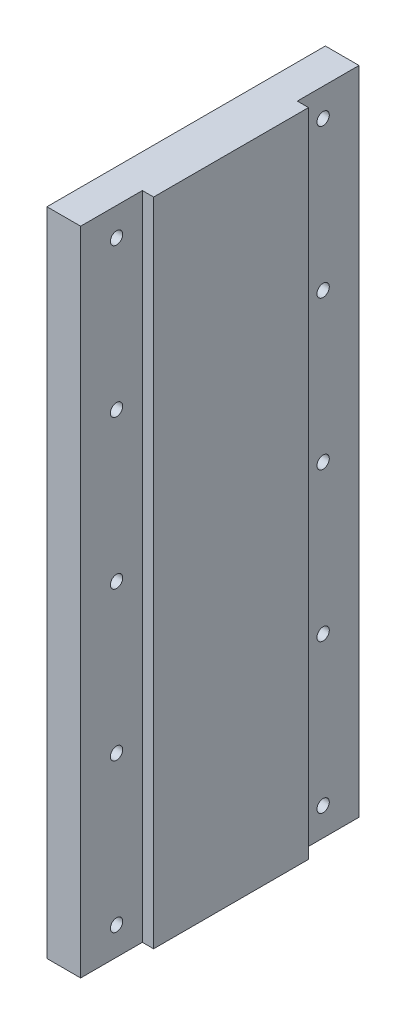
ISO-10303-21;
HEADER;
FILE_DESCRIPTION(('STEP AP214'),'2;1');
FILE_NAME('part.step','',(''),(''),'','','');
FILE_SCHEMA(('AUTOMOTIVE_DESIGN { 1 0 10303 214 1 1 1 1 }'));
ENDSEC;
DATA;
#1=APPLICATION_CONTEXT('core data for automotive mechanical design processes');
#2=APPLICATION_PROTOCOL_DEFINITION('international standard','automotive_design',2000,#1);
#3=PRODUCT_CONTEXT('',#1,'mechanical');
#4=PRODUCT('Part','Part','',(#3));
#5=PRODUCT_RELATED_PRODUCT_CATEGORY('part','',(#4));
#6=PRODUCT_DEFINITION_FORMATION('','',#4);
#7=PRODUCT_DEFINITION_CONTEXT('part definition',#1,'design');
#8=PRODUCT_DEFINITION('design','',#6,#7);
#9=PRODUCT_DEFINITION_SHAPE('','',#8);
#10=(LENGTH_UNIT() NAMED_UNIT(*) SI_UNIT(.MILLI.,.METRE.));
#11=(NAMED_UNIT(*) PLANE_ANGLE_UNIT() SI_UNIT($,.RADIAN.));
#12=(NAMED_UNIT(*) SI_UNIT($,.STERADIAN.) SOLID_ANGLE_UNIT());
#13=UNCERTAINTY_MEASURE_WITH_UNIT(LENGTH_MEASURE(1.E-05),#10,'distance_accuracy_value','');
#14=(GEOMETRIC_REPRESENTATION_CONTEXT(3) GLOBAL_UNCERTAINTY_ASSIGNED_CONTEXT((#13)) GLOBAL_UNIT_ASSIGNED_CONTEXT((#10,
#11,#12)) REPRESENTATION_CONTEXT('',''));
#15=CARTESIAN_POINT('',(0.,0.,0.));
#16=DIRECTION('',(0.,0.,1.));
#17=DIRECTION('',(1.,0.,0.));
#18=AXIS2_PLACEMENT_3D('',#15,#16,#17);
#19=CARTESIAN_POINT('',(30.,580.,0.));
#20=DIRECTION('',(0.,0.,1.));
#21=DIRECTION('',(1.,0.,0.));
#22=AXIS2_PLACEMENT_3D('',#19,#20,#21);
#23=PLANE('',#22);
#24=DIRECTION('',(-1.,0.,0.));
#25=VECTOR('',#24,1.);
#26=CARTESIAN_POINT('',(30.,0.,0.));
#27=LINE('',#26,#25);
#28=CARTESIAN_POINT('',(30.,0.,0.));
#29=VERTEX_POINT('',#28);
#30=CARTESIAN_POINT('',(0.,0.,0.));
#31=VERTEX_POINT('',#30);
#32=EDGE_CURVE('E136',#29,#31,#27,.T.);
#33=ORIENTED_EDGE('',*,*,#32,.T.);
#34=DIRECTION('',(0.,-1.,0.));
#35=VECTOR('',#34,1.);
#36=CARTESIAN_POINT('',(0.,580.,0.));
#37=LINE('',#36,#35);
#38=CARTESIAN_POINT('',(0.,580.,0.));
#39=VERTEX_POINT('',#38);
#40=EDGE_CURVE('E164',#39,#31,#37,.T.);
#41=ORIENTED_EDGE('',*,*,#40,.F.);
#42=DIRECTION('',(-1.,0.,0.));
#43=VECTOR('',#42,1.);
#44=CARTESIAN_POINT('',(30.,580.,0.));
#45=LINE('',#44,#43);
#46=CARTESIAN_POINT('',(30.,580.,0.));
#47=VERTEX_POINT('',#46);
#48=EDGE_CURVE('E151',#47,#39,#45,.T.);
#49=ORIENTED_EDGE('',*,*,#48,.F.);
#50=DIRECTION('',(0.,-1.,0.));
#51=VECTOR('',#50,1.);
#52=CARTESIAN_POINT('',(30.,580.,0.));
#53=LINE('',#52,#51);
#54=EDGE_CURVE('E132',#47,#29,#53,.T.);
#55=ORIENTED_EDGE('',*,*,#54,.T.);
#56=EDGE_LOOP('',(#33,#41,#49,#55));
#57=FACE_BOUND('',#56,.T.);
#58=ADVANCED_FACE('F37',(#57),#23,.F.);
#59=CARTESIAN_POINT('',(0.,580.,0.));
#60=DIRECTION('',(1.,0.,0.));
#61=DIRECTION('',(0.,0.,-1.));
#62=AXIS2_PLACEMENT_3D('',#59,#60,#61);
#63=PLANE('',#62);
#64=CARTESIAN_POINT('',(0.,555.,216.));
#65=DIRECTION('',(1.,0.,0.));
#66=DIRECTION('',(0.,0.,-1.));
#67=AXIS2_PLACEMENT_3D('',#64,#65,#66);
#68=CIRCLE('',#67,11.5000000000001);
#69=CARTESIAN_POINT('',(0.,555.,204.5));
#70=VERTEX_POINT('',#69);
#71=EDGE_CURVE('E11',#70,#70,#68,.T.);
#72=ORIENTED_EDGE('',*,*,#71,.T.);
#73=EDGE_LOOP('',(#72));
#74=FACE_BOUND('',#73,.T.);
#75=CARTESIAN_POINT('',(0.,555.,32.));
#76=DIRECTION('',(1.,0.,0.));
#77=DIRECTION('',(0.,0.,-1.));
#78=AXIS2_PLACEMENT_3D('',#75,#76,#77);
#79=CIRCLE('',#78,11.5000000000001);
#80=CARTESIAN_POINT('',(0.,555.,20.4999999999999));
#81=VERTEX_POINT('',#80);
#82=EDGE_CURVE('E217',#81,#81,#79,.T.);
#83=ORIENTED_EDGE('',*,*,#82,.T.);
#84=EDGE_LOOP('',(#83));
#85=FACE_BOUND('',#84,.T.);
#86=CARTESIAN_POINT('',(0.,422.5,216.));
#87=DIRECTION('',(1.,0.,0.));
#88=DIRECTION('',(0.,0.,-1.));
#89=AXIS2_PLACEMENT_3D('',#86,#87,#88);
#90=CIRCLE('',#89,11.5000000000001);
#91=CARTESIAN_POINT('',(0.,422.5,204.5));
#92=VERTEX_POINT('',#91);
#93=EDGE_CURVE('E211',#92,#92,#90,.T.);
#94=ORIENTED_EDGE('',*,*,#93,.T.);
#95=EDGE_LOOP('',(#94));
#96=FACE_BOUND('',#95,.T.);
#97=CARTESIAN_POINT('',(0.,422.5,32.));
#98=DIRECTION('',(1.,0.,0.));
#99=DIRECTION('',(0.,0.,-1.));
#100=AXIS2_PLACEMENT_3D('',#97,#98,#99);
#101=CIRCLE('',#100,11.5000000000001);
#102=CARTESIAN_POINT('',(0.,422.5,20.4999999999999));
#103=VERTEX_POINT('',#102);
#104=EDGE_CURVE('E205',#103,#103,#101,.T.);
#105=ORIENTED_EDGE('',*,*,#104,.T.);
#106=EDGE_LOOP('',(#105));
#107=FACE_BOUND('',#106,.T.);
#108=CARTESIAN_POINT('',(0.,290.,216.));
#109=DIRECTION('',(1.,0.,0.));
#110=DIRECTION('',(0.,0.,-1.));
#111=AXIS2_PLACEMENT_3D('',#108,#109,#110);
#112=CIRCLE('',#111,11.5000000000001);
#113=CARTESIAN_POINT('',(0.,290.,204.5));
#114=VERTEX_POINT('',#113);
#115=EDGE_CURVE('E199',#114,#114,#112,.T.);
#116=ORIENTED_EDGE('',*,*,#115,.T.);
#117=EDGE_LOOP('',(#116));
#118=FACE_BOUND('',#117,.T.);
#119=CARTESIAN_POINT('',(0.,290.,32.));
#120=DIRECTION('',(1.,0.,0.));
#121=DIRECTION('',(0.,0.,-1.));
#122=AXIS2_PLACEMENT_3D('',#119,#120,#121);
#123=CIRCLE('',#122,11.5000000000001);
#124=CARTESIAN_POINT('',(0.,290.,20.4999999999999));
#125=VERTEX_POINT('',#124);
#126=EDGE_CURVE('E193',#125,#125,#123,.T.);
#127=ORIENTED_EDGE('',*,*,#126,.T.);
#128=EDGE_LOOP('',(#127));
#129=FACE_BOUND('',#128,.T.);
#130=CARTESIAN_POINT('',(0.,157.5,216.));
#131=DIRECTION('',(1.,0.,0.));
#132=DIRECTION('',(0.,0.,-1.));
#133=AXIS2_PLACEMENT_3D('',#130,#131,#132);
#134=CIRCLE('',#133,11.5000000000001);
#135=CARTESIAN_POINT('',(0.,157.5,204.5));
#136=VERTEX_POINT('',#135);
#137=EDGE_CURVE('E187',#136,#136,#134,.T.);
#138=ORIENTED_EDGE('',*,*,#137,.T.);
#139=EDGE_LOOP('',(#138));
#140=FACE_BOUND('',#139,.T.);
#141=CARTESIAN_POINT('',(0.,157.5,32.));
#142=DIRECTION('',(1.,0.,0.));
#143=DIRECTION('',(0.,0.,-1.));
#144=AXIS2_PLACEMENT_3D('',#141,#142,#143);
#145=CIRCLE('',#144,11.5000000000001);
#146=CARTESIAN_POINT('',(0.,157.5,20.4999999999999));
#147=VERTEX_POINT('',#146);
#148=EDGE_CURVE('E181',#147,#147,#145,.T.);
#149=ORIENTED_EDGE('',*,*,#148,.T.);
#150=EDGE_LOOP('',(#149));
#151=FACE_BOUND('',#150,.T.);
#152=CARTESIAN_POINT('',(0.,25.,216.));
#153=DIRECTION('',(1.,0.,0.));
#154=DIRECTION('',(0.,0.,-1.));
#155=AXIS2_PLACEMENT_3D('',#152,#153,#154);
#156=CIRCLE('',#155,11.5000000000001);
#157=CARTESIAN_POINT('',(0.,25.,204.5));
#158=VERTEX_POINT('',#157);
#159=EDGE_CURVE('E175',#158,#158,#156,.T.);
#160=ORIENTED_EDGE('',*,*,#159,.T.);
#161=EDGE_LOOP('',(#160));
#162=FACE_BOUND('',#161,.T.);
#163=CARTESIAN_POINT('',(0.,25.,32.));
#164=DIRECTION('',(1.,0.,0.));
#165=DIRECTION('',(0.,0.,-1.));
#166=AXIS2_PLACEMENT_3D('',#163,#164,#165);
#167=CIRCLE('',#166,11.5000000000001);
#168=CARTESIAN_POINT('',(0.,25.,20.4999999999999));
#169=VERTEX_POINT('',#168);
#170=EDGE_CURVE('E169',#169,#169,#167,.T.);
#171=ORIENTED_EDGE('',*,*,#170,.T.);
#172=EDGE_LOOP('',(#171));
#173=FACE_BOUND('',#172,.T.);
#174=DIRECTION('',(0.,0.,1.));
#175=VECTOR('',#174,1.);
#176=CARTESIAN_POINT('',(0.,0.,0.));
#177=LINE('',#176,#175);
#178=CARTESIAN_POINT('',(0.,0.,248.));
#179=VERTEX_POINT('',#178);
#180=EDGE_CURVE('E139',#31,#179,#177,.T.);
#181=ORIENTED_EDGE('',*,*,#180,.T.);
#182=DIRECTION('',(0.,-1.,0.));
#183=VECTOR('',#182,1.);
#184=CARTESIAN_POINT('',(0.,580.,248.));
#185=LINE('',#184,#183);
#186=CARTESIAN_POINT('',(0.,580.,248.));
#187=VERTEX_POINT('',#186);
#188=EDGE_CURVE('E161',#187,#179,#185,.T.);
#189=ORIENTED_EDGE('',*,*,#188,.F.);
#190=DIRECTION('',(0.,0.,1.));
#191=VECTOR('',#190,1.);
#192=CARTESIAN_POINT('',(0.,580.,0.));
#193=LINE('',#192,#191);
#194=EDGE_CURVE('E99',#39,#187,#193,.T.);
#195=ORIENTED_EDGE('',*,*,#194,.F.);
#196=ORIENTED_EDGE('',*,*,#40,.T.);
#197=EDGE_LOOP('',(#181,#189,#195,#196));
#198=FACE_BOUND('',#197,.T.);
#199=ADVANCED_FACE('F235',(#74,#85,#96,#107,#118,#129,#140,#151,#162,#173,#198),#63,.F.);
#200=CARTESIAN_POINT('',(0.,580.,248.));
#201=DIRECTION('',(0.,0.,-1.));
#202=DIRECTION('',(-1.,0.,0.));
#203=AXIS2_PLACEMENT_3D('',#200,#201,#202);
#204=PLANE('',#203);
#205=DIRECTION('',(1.,0.,0.));
#206=VECTOR('',#205,1.);
#207=CARTESIAN_POINT('',(0.,0.,248.));
#208=LINE('',#207,#206);
#209=CARTESIAN_POINT('',(30.,0.,248.));
#210=VERTEX_POINT('',#209);
#211=EDGE_CURVE('E142',#179,#210,#208,.T.);
#212=ORIENTED_EDGE('',*,*,#211,.T.);
#213=DIRECTION('',(0.,-1.,0.));
#214=VECTOR('',#213,1.);
#215=CARTESIAN_POINT('',(30.,580.,248.));
#216=LINE('',#215,#214);
#217=CARTESIAN_POINT('',(30.,580.,248.));
#218=VERTEX_POINT('',#217);
#219=EDGE_CURVE('E158',#218,#210,#216,.T.);
#220=ORIENTED_EDGE('',*,*,#219,.F.);
#221=DIRECTION('',(1.,0.,0.));
#222=VECTOR('',#221,1.);
#223=CARTESIAN_POINT('',(0.,580.,248.));
#224=LINE('',#223,#222);
#225=EDGE_CURVE('E341',#187,#218,#224,.T.);
#226=ORIENTED_EDGE('',*,*,#225,.F.);
#227=ORIENTED_EDGE('',*,*,#188,.T.);
#228=EDGE_LOOP('',(#212,#220,#226,#227));
#229=FACE_BOUND('',#228,.T.);
#230=ADVANCED_FACE('F241',(#229),#204,.F.);
#231=CARTESIAN_POINT('',(30.,580.,248.));
#232=DIRECTION('',(-1.,0.,0.));
#233=DIRECTION('',(0.,0.,1.));
#234=AXIS2_PLACEMENT_3D('',#231,#232,#233);
#235=PLANE('',#234);
#236=CARTESIAN_POINT('',(30.,25.,216.));
#237=DIRECTION('',(1.,0.,0.));
#238=DIRECTION('',(0.,0.,-1.));
#239=AXIS2_PLACEMENT_3D('',#236,#237,#238);
#240=CIRCLE('',#239,5.5);
#241=CARTESIAN_POINT('',(30.,25.,210.5));
#242=VERTEX_POINT('',#241);
#243=EDGE_CURVE('E338',#242,#242,#240,.T.);
#244=ORIENTED_EDGE('',*,*,#243,.F.);
#245=EDGE_LOOP('',(#244));
#246=FACE_BOUND('',#245,.T.);
#247=CARTESIAN_POINT('',(30.,157.5,216.));
#248=DIRECTION('',(1.,0.,0.));
#249=DIRECTION('',(0.,0.,-1.));
#250=AXIS2_PLACEMENT_3D('',#247,#248,#249);
#251=CIRCLE('',#250,5.5);
#252=CARTESIAN_POINT('',(30.,157.5,210.5));
#253=VERTEX_POINT('',#252);
#254=EDGE_CURVE('E589',#253,#253,#251,.T.);
#255=ORIENTED_EDGE('',*,*,#254,.F.);
#256=EDGE_LOOP('',(#255));
#257=FACE_BOUND('',#256,.T.);
#258=CARTESIAN_POINT('',(30.,290.,216.));
#259=DIRECTION('',(1.,0.,0.));
#260=DIRECTION('',(0.,0.,-1.));
#261=AXIS2_PLACEMENT_3D('',#258,#259,#260);
#262=CIRCLE('',#261,5.5);
#263=CARTESIAN_POINT('',(30.,290.,210.5));
#264=VERTEX_POINT('',#263);
#265=EDGE_CURVE('E327',#264,#264,#262,.T.);
#266=ORIENTED_EDGE('',*,*,#265,.F.);
#267=EDGE_LOOP('',(#266));
#268=FACE_BOUND('',#267,.T.);
#269=CARTESIAN_POINT('',(30.,422.5,216.));
#270=DIRECTION('',(1.,0.,0.));
#271=DIRECTION('',(0.,0.,-1.));
#272=AXIS2_PLACEMENT_3D('',#269,#270,#271);
#273=CIRCLE('',#272,5.5);
#274=CARTESIAN_POINT('',(30.,422.5,210.5));
#275=VERTEX_POINT('',#274);
#276=EDGE_CURVE('E321',#275,#275,#273,.T.);
#277=ORIENTED_EDGE('',*,*,#276,.F.);
#278=EDGE_LOOP('',(#277));
#279=FACE_BOUND('',#278,.T.);
#280=CARTESIAN_POINT('',(30.,555.,216.));
#281=DIRECTION('',(1.,0.,0.));
#282=DIRECTION('',(0.,0.,-1.));
#283=AXIS2_PLACEMENT_3D('',#280,#281,#282);
#284=CIRCLE('',#283,5.5);
#285=CARTESIAN_POINT('',(30.,555.,210.5));
#286=VERTEX_POINT('',#285);
#287=EDGE_CURVE('E330',#286,#286,#284,.T.);
#288=ORIENTED_EDGE('',*,*,#287,.F.);
#289=EDGE_LOOP('',(#288));
#290=FACE_BOUND('',#289,.T.);
#291=DIRECTION('',(0.,0.,-1.));
#292=VECTOR('',#291,1.);
#293=CARTESIAN_POINT('',(30.,0.,248.));
#294=LINE('',#293,#292);
#295=CARTESIAN_POINT('',(30.,0.,193.));
#296=VERTEX_POINT('',#295);
#297=EDGE_CURVE('E144',#210,#296,#294,.T.);
#298=ORIENTED_EDGE('',*,*,#297,.T.);
#299=DIRECTION('',(0.,-1.,0.));
#300=VECTOR('',#299,1.);
#301=CARTESIAN_POINT('',(30.,580.,193.));
#302=LINE('',#301,#300);
#303=CARTESIAN_POINT('',(30.,580.,193.));
#304=VERTEX_POINT('',#303);
#305=EDGE_CURVE('E155',#304,#296,#302,.T.);
#306=ORIENTED_EDGE('',*,*,#305,.F.);
#307=DIRECTION('',(0.,0.,-1.));
#308=VECTOR('',#307,1.);
#309=CARTESIAN_POINT('',(30.,580.,248.));
#310=LINE('',#309,#308);
#311=EDGE_CURVE('E343',#218,#304,#310,.T.);
#312=ORIENTED_EDGE('',*,*,#311,.F.);
#313=ORIENTED_EDGE('',*,*,#219,.T.);
#314=EDGE_LOOP('',(#298,#306,#312,#313));
#315=FACE_BOUND('',#314,.T.);
#316=ADVANCED_FACE('F349',(#246,#257,#268,#279,#290,#315),#235,.F.);
#317=CARTESIAN_POINT('',(30.,580.,193.));
#318=DIRECTION('',(0.,0.,-1.));
#319=DIRECTION('',(-1.,0.,0.));
#320=AXIS2_PLACEMENT_3D('',#317,#318,#319);
#321=PLANE('',#320);
#322=DIRECTION('',(1.,0.,0.));
#323=VECTOR('',#322,1.);
#324=CARTESIAN_POINT('',(30.,0.,193.));
#325=LINE('',#324,#323);
#326=CARTESIAN_POINT('',(40.,0.,193.));
#327=VERTEX_POINT('',#326);
#328=EDGE_CURVE('E146',#296,#327,#325,.T.);
#329=ORIENTED_EDGE('',*,*,#328,.T.);
#330=DIRECTION('',(0.,-1.,0.));
#331=VECTOR('',#330,1.);
#332=CARTESIAN_POINT('',(40.,580.,193.));
#333=LINE('',#332,#331);
#334=CARTESIAN_POINT('',(40.,580.,193.));
#335=VERTEX_POINT('',#334);
#336=EDGE_CURVE('E127',#335,#327,#333,.T.);
#337=ORIENTED_EDGE('',*,*,#336,.F.);
#338=DIRECTION('',(1.,0.,0.));
#339=VECTOR('',#338,1.);
#340=CARTESIAN_POINT('',(30.,580.,193.));
#341=LINE('',#340,#339);
#342=EDGE_CURVE('E118',#304,#335,#341,.T.);
#343=ORIENTED_EDGE('',*,*,#342,.F.);
#344=ORIENTED_EDGE('',*,*,#305,.T.);
#345=EDGE_LOOP('',(#329,#337,#343,#344));
#346=FACE_BOUND('',#345,.T.);
#347=ADVANCED_FACE('F353',(#346),#321,.F.);
#348=CARTESIAN_POINT('',(40.,580.,193.));
#349=DIRECTION('',(-1.,0.,0.));
#350=DIRECTION('',(0.,0.,1.));
#351=AXIS2_PLACEMENT_3D('',#348,#349,#350);
#352=PLANE('',#351);
#353=DIRECTION('',(0.,0.,-1.));
#354=VECTOR('',#353,1.);
#355=CARTESIAN_POINT('',(40.,0.,193.));
#356=LINE('',#355,#354);
#357=CARTESIAN_POINT('',(40.,0.,55.));
#358=VERTEX_POINT('',#357);
#359=EDGE_CURVE('E126',#327,#358,#356,.T.);
#360=ORIENTED_EDGE('',*,*,#359,.T.);
#361=DIRECTION('',(0.,-1.,0.));
#362=VECTOR('',#361,1.);
#363=CARTESIAN_POINT('',(40.,580.,55.));
#364=LINE('',#363,#362);
#365=CARTESIAN_POINT('',(40.,580.,55.));
#366=VERTEX_POINT('',#365);
#367=EDGE_CURVE('E123',#366,#358,#364,.T.);
#368=ORIENTED_EDGE('',*,*,#367,.F.);
#369=DIRECTION('',(0.,0.,-1.));
#370=VECTOR('',#369,1.);
#371=CARTESIAN_POINT('',(40.,580.,193.));
#372=LINE('',#371,#370);
#373=EDGE_CURVE('E112',#335,#366,#372,.T.);
#374=ORIENTED_EDGE('',*,*,#373,.F.);
#375=ORIENTED_EDGE('',*,*,#336,.T.);
#376=EDGE_LOOP('',(#360,#368,#374,#375));
#377=FACE_BOUND('',#376,.T.);
#378=ADVANCED_FACE('F124',(#377),#352,.F.);
#379=CARTESIAN_POINT('',(40.,580.,55.));
#380=DIRECTION('',(0.,0.,1.));
#381=DIRECTION('',(1.,0.,0.));
#382=AXIS2_PLACEMENT_3D('',#379,#380,#381);
#383=PLANE('',#382);
#384=DIRECTION('',(-1.,0.,0.));
#385=VECTOR('',#384,1.);
#386=CARTESIAN_POINT('',(40.,0.,55.));
#387=LINE('',#386,#385);
#388=CARTESIAN_POINT('',(30.,0.,55.));
#389=VERTEX_POINT('',#388);
#390=EDGE_CURVE('E84',#358,#389,#387,.T.);
#391=ORIENTED_EDGE('',*,*,#390,.T.);
#392=DIRECTION('',(0.,-1.,0.));
#393=VECTOR('',#392,1.);
#394=CARTESIAN_POINT('',(30.,580.,55.));
#395=LINE('',#394,#393);
#396=CARTESIAN_POINT('',(30.,580.,55.));
#397=VERTEX_POINT('',#396);
#398=EDGE_CURVE('E128',#397,#389,#395,.T.);
#399=ORIENTED_EDGE('',*,*,#398,.F.);
#400=DIRECTION('',(-1.,0.,0.));
#401=VECTOR('',#400,1.);
#402=CARTESIAN_POINT('',(40.,580.,55.));
#403=LINE('',#402,#401);
#404=EDGE_CURVE('E116',#366,#397,#403,.T.);
#405=ORIENTED_EDGE('',*,*,#404,.F.);
#406=ORIENTED_EDGE('',*,*,#367,.T.);
#407=EDGE_LOOP('',(#391,#399,#405,#406));
#408=FACE_BOUND('',#407,.T.);
#409=ADVANCED_FACE('F130',(#408),#383,.F.);
#410=CARTESIAN_POINT('',(30.,580.,55.));
#411=DIRECTION('',(-1.,0.,0.));
#412=DIRECTION('',(0.,0.,1.));
#413=AXIS2_PLACEMENT_3D('',#410,#411,#412);
#414=PLANE('',#413);
#415=CARTESIAN_POINT('',(30.,157.5,32.));
#416=DIRECTION('',(1.,0.,0.));
#417=DIRECTION('',(0.,0.,-1.));
#418=AXIS2_PLACEMENT_3D('',#415,#416,#417);
#419=CIRCLE('',#418,5.5);
#420=CARTESIAN_POINT('',(30.,157.5,26.5));
#421=VERTEX_POINT('',#420);
#422=EDGE_CURVE('E586',#421,#421,#419,.T.);
#423=ORIENTED_EDGE('',*,*,#422,.F.);
#424=EDGE_LOOP('',(#423));
#425=FACE_BOUND('',#424,.T.);
#426=CARTESIAN_POINT('',(30.,290.,32.));
#427=DIRECTION('',(1.,0.,0.));
#428=DIRECTION('',(0.,0.,-1.));
#429=AXIS2_PLACEMENT_3D('',#426,#427,#428);
#430=CIRCLE('',#429,5.5);
#431=CARTESIAN_POINT('',(30.,290.,26.5));
#432=VERTEX_POINT('',#431);
#433=EDGE_CURVE('E594',#432,#432,#430,.T.);
#434=ORIENTED_EDGE('',*,*,#433,.F.);
#435=EDGE_LOOP('',(#434));
#436=FACE_BOUND('',#435,.T.);
#437=CARTESIAN_POINT('',(30.,422.5,32.));
#438=DIRECTION('',(1.,0.,0.));
#439=DIRECTION('',(0.,0.,-1.));
#440=AXIS2_PLACEMENT_3D('',#437,#438,#439);
#441=CIRCLE('',#440,5.5);
#442=CARTESIAN_POINT('',(30.,422.5,26.5));
#443=VERTEX_POINT('',#442);
#444=EDGE_CURVE('E323',#443,#443,#441,.T.);
#445=ORIENTED_EDGE('',*,*,#444,.F.);
#446=EDGE_LOOP('',(#445));
#447=FACE_BOUND('',#446,.T.);
#448=CARTESIAN_POINT('',(30.,555.,32.));
#449=DIRECTION('',(1.,0.,0.));
#450=DIRECTION('',(0.,0.,-1.));
#451=AXIS2_PLACEMENT_3D('',#448,#449,#450);
#452=CIRCLE('',#451,5.5);
#453=CARTESIAN_POINT('',(30.,555.,26.5));
#454=VERTEX_POINT('',#453);
#455=EDGE_CURVE('E324',#454,#454,#452,.T.);
#456=ORIENTED_EDGE('',*,*,#455,.F.);
#457=EDGE_LOOP('',(#456));
#458=FACE_BOUND('',#457,.T.);
#459=CARTESIAN_POINT('',(30.,25.,32.));
#460=DIRECTION('',(1.,0.,0.));
#461=DIRECTION('',(0.,0.,-1.));
#462=AXIS2_PLACEMENT_3D('',#459,#460,#461);
#463=CIRCLE('',#462,5.5);
#464=CARTESIAN_POINT('',(30.,25.,26.5));
#465=VERTEX_POINT('',#464);
#466=EDGE_CURVE('E140',#465,#465,#463,.T.);
#467=ORIENTED_EDGE('',*,*,#466,.F.);
#468=EDGE_LOOP('',(#467));
#469=FACE_BOUND('',#468,.T.);
#470=DIRECTION('',(0.,0.,-1.));
#471=VECTOR('',#470,1.);
#472=CARTESIAN_POINT('',(30.,0.,55.));
#473=LINE('',#472,#471);
#474=EDGE_CURVE('E90',#389,#29,#473,.T.);
#475=ORIENTED_EDGE('',*,*,#474,.T.);
#476=ORIENTED_EDGE('',*,*,#54,.F.);
#477=DIRECTION('',(0.,0.,-1.));
#478=VECTOR('',#477,1.);
#479=CARTESIAN_POINT('',(30.,580.,55.));
#480=LINE('',#479,#478);
#481=EDGE_CURVE('E55',#397,#47,#480,.T.);
#482=ORIENTED_EDGE('',*,*,#481,.F.);
#483=ORIENTED_EDGE('',*,*,#398,.T.);
#484=EDGE_LOOP('',(#475,#476,#482,#483));
#485=FACE_BOUND('',#484,.T.);
#486=ADVANCED_FACE('F360',(#425,#436,#447,#458,#469,#485),#414,.F.);
#487=CARTESIAN_POINT('',(0.,580.,0.));
#488=DIRECTION('',(0.,1.,0.));
#489=DIRECTION('',(0.,0.,1.));
#490=AXIS2_PLACEMENT_3D('',#487,#488,#489);
#491=PLANE('',#490);
#492=ORIENTED_EDGE('',*,*,#48,.T.);
#493=ORIENTED_EDGE('',*,*,#194,.T.);
#494=ORIENTED_EDGE('',*,*,#225,.T.);
#495=ORIENTED_EDGE('',*,*,#311,.T.);
#496=ORIENTED_EDGE('',*,*,#342,.T.);
#497=ORIENTED_EDGE('',*,*,#373,.T.);
#498=ORIENTED_EDGE('',*,*,#404,.T.);
#499=ORIENTED_EDGE('',*,*,#481,.T.);
#500=EDGE_LOOP('',(#492,#493,#494,#495,#496,#497,#498,#499));
#501=FACE_BOUND('',#500,.T.);
#502=ADVANCED_FACE('F114',(#501),#491,.T.);
#503=CARTESIAN_POINT('',(0.,0.,0.));
#504=DIRECTION('',(0.,1.,0.));
#505=DIRECTION('',(0.,0.,1.));
#506=AXIS2_PLACEMENT_3D('',#503,#504,#505);
#507=PLANE('',#506);
#508=ORIENTED_EDGE('',*,*,#32,.F.);
#509=ORIENTED_EDGE('',*,*,#474,.F.);
#510=ORIENTED_EDGE('',*,*,#390,.F.);
#511=ORIENTED_EDGE('',*,*,#359,.F.);
#512=ORIENTED_EDGE('',*,*,#328,.F.);
#513=ORIENTED_EDGE('',*,*,#297,.F.);
#514=ORIENTED_EDGE('',*,*,#211,.F.);
#515=ORIENTED_EDGE('',*,*,#180,.F.);
#516=EDGE_LOOP('',(#508,#509,#510,#511,#512,#513,#514,#515));
#517=FACE_BOUND('',#516,.T.);
#518=ADVANCED_FACE('F356',(#517),#507,.F.);
#519=CARTESIAN_POINT('',(-0.001000000000001,25.,32.));
#520=DIRECTION('',(1.,0.,0.));
#521=DIRECTION('',(0.,0.,-1.));
#522=AXIS2_PLACEMENT_3D('',#519,#520,#521);
#523=CYLINDRICAL_SURFACE('',#522,5.5);
#524=CARTESIAN_POINT('',(6.00000000000003,25.,32.));
#525=DIRECTION('',(1.,0.,0.));
#526=DIRECTION('',(0.,0.,-1.));
#527=AXIS2_PLACEMENT_3D('',#524,#525,#526);
#528=CIRCLE('',#527,5.5);
#529=CARTESIAN_POINT('',(6.00000000000003,25.,26.5));
#530=VERTEX_POINT('',#529);
#531=EDGE_CURVE('E166',#530,#530,#528,.F.);
#532=ORIENTED_EDGE('',*,*,#531,.T.);
#533=EDGE_LOOP('',(#532));
#534=FACE_BOUND('',#533,.T.);
#535=ORIENTED_EDGE('',*,*,#466,.T.);
#536=EDGE_LOOP('',(#535));
#537=FACE_BOUND('',#536,.T.);
#538=ADVANCED_FACE('F254',(#534,#537),#523,.F.);
#539=CARTESIAN_POINT('',(6.00000000000003,25.,32.));
#540=DIRECTION('',(-1.,0.,0.));
#541=DIRECTION('',(0.,0.,1.));
#542=AXIS2_PLACEMENT_3D('',#539,#540,#541);
#543=CONICAL_SURFACE('',#542,5.5,0.785398163397451);
#544=ORIENTED_EDGE('',*,*,#170,.F.);
#545=EDGE_LOOP('',(#544));
#546=FACE_BOUND('',#545,.T.);
#547=ORIENTED_EDGE('',*,*,#531,.F.);
#548=EDGE_LOOP('',(#547));
#549=FACE_BOUND('',#548,.T.);
#550=ADVANCED_FACE('F247',(#546,#549),#543,.F.);
#551=CARTESIAN_POINT('',(-0.001000000000001,555.,32.));
#552=DIRECTION('',(1.,0.,0.));
#553=DIRECTION('',(0.,0.,-1.));
#554=AXIS2_PLACEMENT_3D('',#551,#552,#553);
#555=CYLINDRICAL_SURFACE('',#554,5.5);
#556=CARTESIAN_POINT('',(6.00000000000003,555.,32.));
#557=DIRECTION('',(1.,0.,0.));
#558=DIRECTION('',(0.,0.,-1.));
#559=AXIS2_PLACEMENT_3D('',#556,#557,#558);
#560=CIRCLE('',#559,5.5);
#561=CARTESIAN_POINT('',(6.00000000000003,555.,26.5));
#562=VERTEX_POINT('',#561);
#563=EDGE_CURVE('E214',#562,#562,#560,.F.);
#564=ORIENTED_EDGE('',*,*,#563,.T.);
#565=EDGE_LOOP('',(#564));
#566=FACE_BOUND('',#565,.T.);
#567=ORIENTED_EDGE('',*,*,#455,.T.);
#568=EDGE_LOOP('',(#567));
#569=FACE_BOUND('',#568,.T.);
#570=ADVANCED_FACE('F253',(#566,#569),#555,.F.);
#571=CARTESIAN_POINT('',(-0.001000000000001,422.5,32.));
#572=DIRECTION('',(1.,0.,0.));
#573=DIRECTION('',(0.,0.,-1.));
#574=AXIS2_PLACEMENT_3D('',#571,#572,#573);
#575=CYLINDRICAL_SURFACE('',#574,5.5);
#576=CARTESIAN_POINT('',(6.00000000000003,422.5,32.));
#577=DIRECTION('',(1.,0.,0.));
#578=DIRECTION('',(0.,0.,-1.));
#579=AXIS2_PLACEMENT_3D('',#576,#577,#578);
#580=CIRCLE('',#579,5.5);
#581=CARTESIAN_POINT('',(6.00000000000003,422.5,26.5));
#582=VERTEX_POINT('',#581);
#583=EDGE_CURVE('E202',#582,#582,#580,.F.);
#584=ORIENTED_EDGE('',*,*,#583,.T.);
#585=EDGE_LOOP('',(#584));
#586=FACE_BOUND('',#585,.T.);
#587=ORIENTED_EDGE('',*,*,#444,.T.);
#588=EDGE_LOOP('',(#587));
#589=FACE_BOUND('',#588,.T.);
#590=ADVANCED_FACE('F456',(#586,#589),#575,.F.);
#591=CARTESIAN_POINT('',(-0.001000000000001,290.,32.));
#592=DIRECTION('',(1.,0.,0.));
#593=DIRECTION('',(0.,0.,-1.));
#594=AXIS2_PLACEMENT_3D('',#591,#592,#593);
#595=CYLINDRICAL_SURFACE('',#594,5.5);
#596=CARTESIAN_POINT('',(6.00000000000003,290.,32.));
#597=DIRECTION('',(1.,0.,0.));
#598=DIRECTION('',(0.,0.,-1.));
#599=AXIS2_PLACEMENT_3D('',#596,#597,#598);
#600=CIRCLE('',#599,5.5);
#601=CARTESIAN_POINT('',(6.00000000000003,290.,26.5));
#602=VERTEX_POINT('',#601);
#603=EDGE_CURVE('E190',#602,#602,#600,.F.);
#604=ORIENTED_EDGE('',*,*,#603,.T.);
#605=EDGE_LOOP('',(#604));
#606=FACE_BOUND('',#605,.T.);
#607=ORIENTED_EDGE('',*,*,#433,.T.);
#608=EDGE_LOOP('',(#607));
#609=FACE_BOUND('',#608,.T.);
#610=ADVANCED_FACE('F463',(#606,#609),#595,.F.);
#611=CARTESIAN_POINT('',(-0.001000000000001,157.5,32.));
#612=DIRECTION('',(1.,0.,0.));
#613=DIRECTION('',(0.,0.,-1.));
#614=AXIS2_PLACEMENT_3D('',#611,#612,#613);
#615=CYLINDRICAL_SURFACE('',#614,5.5);
#616=CARTESIAN_POINT('',(6.00000000000003,157.5,32.));
#617=DIRECTION('',(1.,0.,0.));
#618=DIRECTION('',(0.,0.,-1.));
#619=AXIS2_PLACEMENT_3D('',#616,#617,#618);
#620=CIRCLE('',#619,5.5);
#621=CARTESIAN_POINT('',(6.00000000000003,157.5,26.5));
#622=VERTEX_POINT('',#621);
#623=EDGE_CURVE('E178',#622,#622,#620,.F.);
#624=ORIENTED_EDGE('',*,*,#623,.T.);
#625=EDGE_LOOP('',(#624));
#626=FACE_BOUND('',#625,.T.);
#627=ORIENTED_EDGE('',*,*,#422,.T.);
#628=EDGE_LOOP('',(#627));
#629=FACE_BOUND('',#628,.T.);
#630=ADVANCED_FACE('F471',(#626,#629),#615,.F.);
#631=CARTESIAN_POINT('',(-0.001000000000001,555.,216.));
#632=DIRECTION('',(1.,0.,0.));
#633=DIRECTION('',(0.,0.,-1.));
#634=AXIS2_PLACEMENT_3D('',#631,#632,#633);
#635=CYLINDRICAL_SURFACE('',#634,5.5);
#636=CARTESIAN_POINT('',(6.00000000000003,555.,216.));
#637=DIRECTION('',(1.,0.,0.));
#638=DIRECTION('',(0.,0.,-1.));
#639=AXIS2_PLACEMENT_3D('',#636,#637,#638);
#640=CIRCLE('',#639,5.5);
#641=CARTESIAN_POINT('',(6.00000000000003,555.,210.5));
#642=VERTEX_POINT('',#641);
#643=EDGE_CURVE('E47',#642,#642,#640,.F.);
#644=ORIENTED_EDGE('',*,*,#643,.T.);
#645=EDGE_LOOP('',(#644));
#646=FACE_BOUND('',#645,.T.);
#647=ORIENTED_EDGE('',*,*,#287,.T.);
#648=EDGE_LOOP('',(#647));
#649=FACE_BOUND('',#648,.T.);
#650=ADVANCED_FACE('F222',(#646,#649),#635,.F.);
#651=CARTESIAN_POINT('',(-0.001000000000001,422.5,216.));
#652=DIRECTION('',(1.,0.,0.));
#653=DIRECTION('',(0.,0.,-1.));
#654=AXIS2_PLACEMENT_3D('',#651,#652,#653);
#655=CYLINDRICAL_SURFACE('',#654,5.5);
#656=CARTESIAN_POINT('',(6.00000000000003,422.5,216.));
#657=DIRECTION('',(1.,0.,0.));
#658=DIRECTION('',(0.,0.,-1.));
#659=AXIS2_PLACEMENT_3D('',#656,#657,#658);
#660=CIRCLE('',#659,5.5);
#661=CARTESIAN_POINT('',(6.00000000000003,422.5,210.5));
#662=VERTEX_POINT('',#661);
#663=EDGE_CURVE('E208',#662,#662,#660,.F.);
#664=ORIENTED_EDGE('',*,*,#663,.T.);
#665=EDGE_LOOP('',(#664));
#666=FACE_BOUND('',#665,.T.);
#667=ORIENTED_EDGE('',*,*,#276,.T.);
#668=EDGE_LOOP('',(#667));
#669=FACE_BOUND('',#668,.T.);
#670=ADVANCED_FACE('F314',(#666,#669),#655,.F.);
#671=CARTESIAN_POINT('',(-0.001000000000001,290.,216.));
#672=DIRECTION('',(1.,0.,0.));
#673=DIRECTION('',(0.,0.,-1.));
#674=AXIS2_PLACEMENT_3D('',#671,#672,#673);
#675=CYLINDRICAL_SURFACE('',#674,5.5);
#676=CARTESIAN_POINT('',(6.00000000000003,290.,216.));
#677=DIRECTION('',(1.,0.,0.));
#678=DIRECTION('',(0.,0.,-1.));
#679=AXIS2_PLACEMENT_3D('',#676,#677,#678);
#680=CIRCLE('',#679,5.5);
#681=CARTESIAN_POINT('',(6.00000000000003,290.,210.5));
#682=VERTEX_POINT('',#681);
#683=EDGE_CURVE('E196',#682,#682,#680,.F.);
#684=ORIENTED_EDGE('',*,*,#683,.T.);
#685=EDGE_LOOP('',(#684));
#686=FACE_BOUND('',#685,.T.);
#687=ORIENTED_EDGE('',*,*,#265,.T.);
#688=EDGE_LOOP('',(#687));
#689=FACE_BOUND('',#688,.T.);
#690=ADVANCED_FACE('F317',(#686,#689),#675,.F.);
#691=CARTESIAN_POINT('',(-0.001000000000001,157.5,216.));
#692=DIRECTION('',(1.,0.,0.));
#693=DIRECTION('',(0.,0.,-1.));
#694=AXIS2_PLACEMENT_3D('',#691,#692,#693);
#695=CYLINDRICAL_SURFACE('',#694,5.5);
#696=CARTESIAN_POINT('',(6.00000000000003,157.5,216.));
#697=DIRECTION('',(1.,0.,0.));
#698=DIRECTION('',(0.,0.,-1.));
#699=AXIS2_PLACEMENT_3D('',#696,#697,#698);
#700=CIRCLE('',#699,5.5);
#701=CARTESIAN_POINT('',(6.00000000000003,157.5,210.5));
#702=VERTEX_POINT('',#701);
#703=EDGE_CURVE('E184',#702,#702,#700,.F.);
#704=ORIENTED_EDGE('',*,*,#703,.T.);
#705=EDGE_LOOP('',(#704));
#706=FACE_BOUND('',#705,.T.);
#707=ORIENTED_EDGE('',*,*,#254,.T.);
#708=EDGE_LOOP('',(#707));
#709=FACE_BOUND('',#708,.T.);
#710=ADVANCED_FACE('F496',(#706,#709),#695,.F.);
#711=CARTESIAN_POINT('',(-0.001000000000001,25.,216.));
#712=DIRECTION('',(1.,0.,0.));
#713=DIRECTION('',(0.,0.,-1.));
#714=AXIS2_PLACEMENT_3D('',#711,#712,#713);
#715=CYLINDRICAL_SURFACE('',#714,5.5);
#716=CARTESIAN_POINT('',(6.00000000000003,25.,216.));
#717=DIRECTION('',(1.,0.,0.));
#718=DIRECTION('',(0.,0.,-1.));
#719=AXIS2_PLACEMENT_3D('',#716,#717,#718);
#720=CIRCLE('',#719,5.5);
#721=CARTESIAN_POINT('',(6.00000000000003,25.,210.5));
#722=VERTEX_POINT('',#721);
#723=EDGE_CURVE('E172',#722,#722,#720,.F.);
#724=ORIENTED_EDGE('',*,*,#723,.T.);
#725=EDGE_LOOP('',(#724));
#726=FACE_BOUND('',#725,.T.);
#727=ORIENTED_EDGE('',*,*,#243,.T.);
#728=EDGE_LOOP('',(#727));
#729=FACE_BOUND('',#728,.T.);
#730=ADVANCED_FACE('F263',(#726,#729),#715,.F.);
#731=CARTESIAN_POINT('',(6.00000000000003,25.,216.));
#732=DIRECTION('',(-1.,0.,0.));
#733=DIRECTION('',(0.,0.,1.));
#734=AXIS2_PLACEMENT_3D('',#731,#732,#733);
#735=CONICAL_SURFACE('',#734,5.5,0.785398163397451);
#736=ORIENTED_EDGE('',*,*,#159,.F.);
#737=EDGE_LOOP('',(#736));
#738=FACE_BOUND('',#737,.T.);
#739=ORIENTED_EDGE('',*,*,#723,.F.);
#740=EDGE_LOOP('',(#739));
#741=FACE_BOUND('',#740,.T.);
#742=ADVANCED_FACE('F256',(#738,#741),#735,.F.);
#743=CARTESIAN_POINT('',(6.00000000000003,157.5,32.));
#744=DIRECTION('',(-1.,0.,0.));
#745=DIRECTION('',(0.,0.,1.));
#746=AXIS2_PLACEMENT_3D('',#743,#744,#745);
#747=CONICAL_SURFACE('',#746,5.5,0.785398163397451);
#748=ORIENTED_EDGE('',*,*,#148,.F.);
#749=EDGE_LOOP('',(#748));
#750=FACE_BOUND('',#749,.T.);
#751=ORIENTED_EDGE('',*,*,#623,.F.);
#752=EDGE_LOOP('',(#751));
#753=FACE_BOUND('',#752,.T.);
#754=ADVANCED_FACE('F262',(#750,#753),#747,.F.);
#755=CARTESIAN_POINT('',(6.00000000000003,157.5,216.));
#756=DIRECTION('',(-1.,0.,0.));
#757=DIRECTION('',(0.,0.,1.));
#758=AXIS2_PLACEMENT_3D('',#755,#756,#757);
#759=CONICAL_SURFACE('',#758,5.5,0.785398163397451);
#760=ORIENTED_EDGE('',*,*,#137,.F.);
#761=EDGE_LOOP('',(#760));
#762=FACE_BOUND('',#761,.T.);
#763=ORIENTED_EDGE('',*,*,#703,.F.);
#764=EDGE_LOOP('',(#763));
#765=FACE_BOUND('',#764,.T.);
#766=ADVANCED_FACE('F270',(#762,#765),#759,.F.);
#767=CARTESIAN_POINT('',(6.00000000000003,290.,32.));
#768=DIRECTION('',(-1.,0.,0.));
#769=DIRECTION('',(0.,0.,1.));
#770=AXIS2_PLACEMENT_3D('',#767,#768,#769);
#771=CONICAL_SURFACE('',#770,5.5,0.785398163397451);
#772=ORIENTED_EDGE('',*,*,#126,.F.);
#773=EDGE_LOOP('',(#772));
#774=FACE_BOUND('',#773,.T.);
#775=ORIENTED_EDGE('',*,*,#603,.F.);
#776=EDGE_LOOP('',(#775));
#777=FACE_BOUND('',#776,.T.);
#778=ADVANCED_FACE('F277',(#774,#777),#771,.F.);
#779=CARTESIAN_POINT('',(6.00000000000003,290.,216.));
#780=DIRECTION('',(-1.,0.,0.));
#781=DIRECTION('',(0.,0.,1.));
#782=AXIS2_PLACEMENT_3D('',#779,#780,#781);
#783=CONICAL_SURFACE('',#782,5.5,0.785398163397451);
#784=ORIENTED_EDGE('',*,*,#115,.F.);
#785=EDGE_LOOP('',(#784));
#786=FACE_BOUND('',#785,.T.);
#787=ORIENTED_EDGE('',*,*,#683,.F.);
#788=EDGE_LOOP('',(#787));
#789=FACE_BOUND('',#788,.T.);
#790=ADVANCED_FACE('F284',(#786,#789),#783,.F.);
#791=CARTESIAN_POINT('',(6.00000000000003,422.5,32.));
#792=DIRECTION('',(-1.,0.,0.));
#793=DIRECTION('',(0.,0.,1.));
#794=AXIS2_PLACEMENT_3D('',#791,#792,#793);
#795=CONICAL_SURFACE('',#794,5.5,0.785398163397451);
#796=ORIENTED_EDGE('',*,*,#104,.F.);
#797=EDGE_LOOP('',(#796));
#798=FACE_BOUND('',#797,.T.);
#799=ORIENTED_EDGE('',*,*,#583,.F.);
#800=EDGE_LOOP('',(#799));
#801=FACE_BOUND('',#800,.T.);
#802=ADVANCED_FACE('F291',(#798,#801),#795,.F.);
#803=CARTESIAN_POINT('',(6.00000000000003,422.5,216.));
#804=DIRECTION('',(-1.,0.,0.));
#805=DIRECTION('',(0.,0.,1.));
#806=AXIS2_PLACEMENT_3D('',#803,#804,#805);
#807=CONICAL_SURFACE('',#806,5.5,0.785398163397451);
#808=ORIENTED_EDGE('',*,*,#93,.F.);
#809=EDGE_LOOP('',(#808));
#810=FACE_BOUND('',#809,.T.);
#811=ORIENTED_EDGE('',*,*,#663,.F.);
#812=EDGE_LOOP('',(#811));
#813=FACE_BOUND('',#812,.T.);
#814=ADVANCED_FACE('F231',(#810,#813),#807,.F.);
#815=CARTESIAN_POINT('',(6.00000000000003,555.,32.));
#816=DIRECTION('',(-1.,0.,0.));
#817=DIRECTION('',(0.,0.,1.));
#818=AXIS2_PLACEMENT_3D('',#815,#816,#817);
#819=CONICAL_SURFACE('',#818,5.5,0.785398163397451);
#820=ORIENTED_EDGE('',*,*,#82,.F.);
#821=EDGE_LOOP('',(#820));
#822=FACE_BOUND('',#821,.T.);
#823=ORIENTED_EDGE('',*,*,#563,.F.);
#824=EDGE_LOOP('',(#823));
#825=FACE_BOUND('',#824,.T.);
#826=ADVANCED_FACE('F226',(#822,#825),#819,.F.);
#827=CARTESIAN_POINT('',(6.00000000000003,555.,216.));
#828=DIRECTION('',(-1.,0.,0.));
#829=DIRECTION('',(0.,0.,1.));
#830=AXIS2_PLACEMENT_3D('',#827,#828,#829);
#831=CONICAL_SURFACE('',#830,5.5,0.785398163397451);
#832=ORIENTED_EDGE('',*,*,#71,.F.);
#833=EDGE_LOOP('',(#832));
#834=FACE_BOUND('',#833,.T.);
#835=ORIENTED_EDGE('',*,*,#643,.F.);
#836=EDGE_LOOP('',(#835));
#837=FACE_BOUND('',#836,.T.);
#838=ADVANCED_FACE('F40',(#834,#837),#831,.F.);
#839=CLOSED_SHELL('',(#58,#199,#230,#316,#347,#378,#409,#486,#502,#518,#538,#550,#570,#590,#610,
#630,#650,#670,#690,#710,#730,#742,#754,#766,#778,#790,#802,#814,#826,#838));
#840=MANIFOLD_SOLID_BREP('B2',#839);
#841=ADVANCED_BREP_SHAPE_REPRESENTATION('',(#18,#840),#14);
#842=SHAPE_DEFINITION_REPRESENTATION(#9,#841);
ENDSEC;
END-ISO-10303-21;
